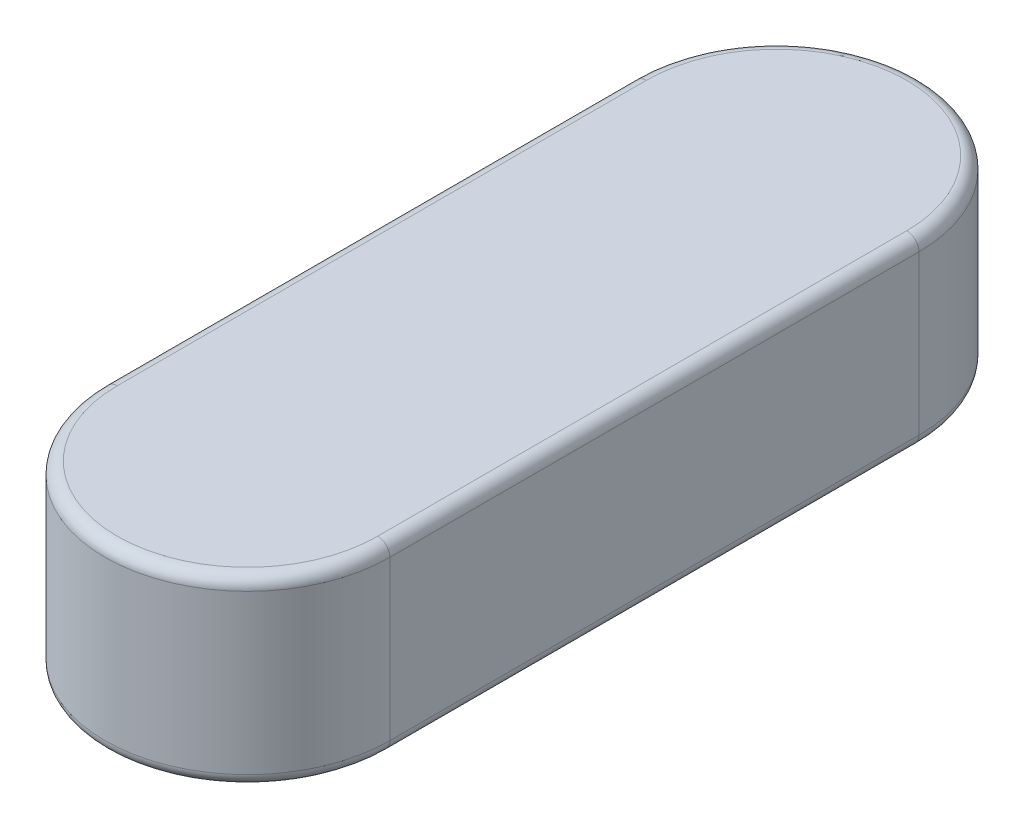
ISO-10303-21;
HEADER;
FILE_DESCRIPTION(('STEP AP214'),'2;1');
FILE_NAME('part.step','',(''),(''),'','','');
FILE_SCHEMA(('AUTOMOTIVE_DESIGN { 1 0 10303 214 1 1 1 1 }'));
ENDSEC;
DATA;
#1=APPLICATION_CONTEXT('core data for automotive mechanical design processes');
#2=APPLICATION_PROTOCOL_DEFINITION('international standard','automotive_design',2000,#1);
#3=PRODUCT_CONTEXT('',#1,'mechanical');
#4=PRODUCT('Part','Part','',(#3));
#5=PRODUCT_RELATED_PRODUCT_CATEGORY('part','',(#4));
#6=PRODUCT_DEFINITION_FORMATION('','',#4);
#7=PRODUCT_DEFINITION_CONTEXT('part definition',#1,'design');
#8=PRODUCT_DEFINITION('design','',#6,#7);
#9=PRODUCT_DEFINITION_SHAPE('','',#8);
#10=(LENGTH_UNIT() NAMED_UNIT(*) SI_UNIT(.MILLI.,.METRE.));
#11=(NAMED_UNIT(*) PLANE_ANGLE_UNIT() SI_UNIT($,.RADIAN.));
#12=(NAMED_UNIT(*) SI_UNIT($,.STERADIAN.) SOLID_ANGLE_UNIT());
#13=UNCERTAINTY_MEASURE_WITH_UNIT(LENGTH_MEASURE(1.E-05),#10,'distance_accuracy_value','');
#14=(GEOMETRIC_REPRESENTATION_CONTEXT(3) GLOBAL_UNCERTAINTY_ASSIGNED_CONTEXT((#13)) GLOBAL_UNIT_ASSIGNED_CONTEXT((#10,
#11,#12)) REPRESENTATION_CONTEXT('',''));
#15=CARTESIAN_POINT('',(0.,0.,0.));
#16=DIRECTION('',(0.,0.,1.));
#17=DIRECTION('',(1.,0.,0.));
#18=AXIS2_PLACEMENT_3D('',#15,#16,#17);
#19=CARTESIAN_POINT('',(0.,9.,0.));
#20=DIRECTION('',(0.,-1.,0.));
#21=DIRECTION('',(0.,0.,-1.));
#22=AXIS2_PLACEMENT_3D('',#19,#20,#21);
#23=CYLINDRICAL_SURFACE('',#22,7.);
#24=DIRECTION('',(0.,-1.,0.));
#25=VECTOR('',#24,1.);
#26=CARTESIAN_POINT('',(-7.,9.,0.));
#27=LINE('',#26,#25);
#28=CARTESIAN_POINT('',(-7.,8.4,0.));
#29=VERTEX_POINT('',#28);
#30=CARTESIAN_POINT('',(-7.,0.6,0.));
#31=VERTEX_POINT('',#30);
#32=EDGE_CURVE('E154',#29,#31,#27,.T.);
#33=ORIENTED_EDGE('',*,*,#32,.T.);
#34=CARTESIAN_POINT('',(0.,0.6,0.));
#35=DIRECTION('',(0.,1.,0.));
#36=DIRECTION('',(0.,0.,1.));
#37=AXIS2_PLACEMENT_3D('',#34,#35,#36);
#38=CIRCLE('',#37,7.);
#39=CARTESIAN_POINT('',(7.,0.6,0.));
#40=VERTEX_POINT('',#39);
#41=EDGE_CURVE('E163',#31,#40,#38,.T.);
#42=ORIENTED_EDGE('',*,*,#41,.T.);
#43=DIRECTION('',(0.,-1.,0.));
#44=VECTOR('',#43,1.);
#45=CARTESIAN_POINT('',(7.,9.,0.));
#46=LINE('',#45,#44);
#47=CARTESIAN_POINT('',(7.,8.4,0.));
#48=VERTEX_POINT('',#47);
#49=EDGE_CURVE('E132',#48,#40,#46,.T.);
#50=ORIENTED_EDGE('',*,*,#49,.F.);
#51=CARTESIAN_POINT('',(0.,8.4,0.));
#52=DIRECTION('',(0.,1.,0.));
#53=DIRECTION('',(0.,0.,1.));
#54=AXIS2_PLACEMENT_3D('',#51,#52,#53);
#55=CIRCLE('',#54,7.);
#56=EDGE_CURVE('E165',#48,#29,#55,.F.);
#57=ORIENTED_EDGE('',*,*,#56,.T.);
#58=EDGE_LOOP('',(#33,#42,#50,#57));
#59=FACE_BOUND('',#58,.T.);
#60=ADVANCED_FACE('F45',(#59),#23,.T.);
#61=CARTESIAN_POINT('',(7.,9.,0.));
#62=DIRECTION('',(-1.,0.,0.));
#63=DIRECTION('',(0.,0.,1.));
#64=AXIS2_PLACEMENT_3D('',#61,#62,#63);
#65=PLANE('',#64);
#66=ORIENTED_EDGE('',*,*,#49,.T.);
#67=DIRECTION('',(0.,0.,-1.));
#68=VECTOR('',#67,1.);
#69=CARTESIAN_POINT('',(7.,0.6,0.));
#70=LINE('',#69,#68);
#71=CARTESIAN_POINT('',(7.,0.6,-26.));
#72=VERTEX_POINT('',#71);
#73=EDGE_CURVE('E131',#40,#72,#70,.T.);
#74=ORIENTED_EDGE('',*,*,#73,.T.);
#75=DIRECTION('',(0.,-1.,0.));
#76=VECTOR('',#75,1.);
#77=CARTESIAN_POINT('',(7.,9.,-26.));
#78=LINE('',#77,#76);
#79=CARTESIAN_POINT('',(7.,8.4,-26.));
#80=VERTEX_POINT('',#79);
#81=EDGE_CURVE('E114',#80,#72,#78,.T.);
#82=ORIENTED_EDGE('',*,*,#81,.F.);
#83=DIRECTION('',(0.,0.,-1.));
#84=VECTOR('',#83,1.);
#85=CARTESIAN_POINT('',(7.,8.4,0.));
#86=LINE('',#85,#84);
#87=EDGE_CURVE('E128',#80,#48,#86,.F.);
#88=ORIENTED_EDGE('',*,*,#87,.T.);
#89=EDGE_LOOP('',(#66,#74,#82,#88));
#90=FACE_BOUND('',#89,.T.);
#91=ADVANCED_FACE('F127',(#90),#65,.F.);
#92=CARTESIAN_POINT('',(0.,9.,-26.));
#93=DIRECTION('',(0.,-1.,0.));
#94=DIRECTION('',(0.,0.,-1.));
#95=AXIS2_PLACEMENT_3D('',#92,#93,#94);
#96=CYLINDRICAL_SURFACE('',#95,7.);
#97=ORIENTED_EDGE('',*,*,#81,.T.);
#98=CARTESIAN_POINT('',(0.,0.6,-26.));
#99=DIRECTION('',(0.,1.,0.));
#100=DIRECTION('',(0.,0.,1.));
#101=AXIS2_PLACEMENT_3D('',#98,#99,#100);
#102=CIRCLE('',#101,7.);
#103=CARTESIAN_POINT('',(-7.,0.6,-26.));
#104=VERTEX_POINT('',#103);
#105=EDGE_CURVE('E120',#72,#104,#102,.T.);
#106=ORIENTED_EDGE('',*,*,#105,.T.);
#107=DIRECTION('',(0.,-1.,0.));
#108=VECTOR('',#107,1.);
#109=CARTESIAN_POINT('',(-7.,9.,-26.));
#110=LINE('',#109,#108);
#111=CARTESIAN_POINT('',(-7.,8.4,-26.));
#112=VERTEX_POINT('',#111);
#113=EDGE_CURVE('E116',#112,#104,#110,.T.);
#114=ORIENTED_EDGE('',*,*,#113,.F.);
#115=CARTESIAN_POINT('',(0.,8.4,-26.));
#116=DIRECTION('',(0.,1.,0.));
#117=DIRECTION('',(0.,0.,1.));
#118=AXIS2_PLACEMENT_3D('',#115,#116,#117);
#119=CIRCLE('',#118,7.);
#120=EDGE_CURVE('E111',#112,#80,#119,.F.);
#121=ORIENTED_EDGE('',*,*,#120,.T.);
#122=EDGE_LOOP('',(#97,#106,#114,#121));
#123=FACE_BOUND('',#122,.T.);
#124=ADVANCED_FACE('F113',(#123),#96,.T.);
#125=CARTESIAN_POINT('',(-7.,9.,0.));
#126=DIRECTION('',(1.,0.,0.));
#127=DIRECTION('',(0.,0.,-1.));
#128=AXIS2_PLACEMENT_3D('',#125,#126,#127);
#129=PLANE('',#128);
#130=ORIENTED_EDGE('',*,*,#113,.T.);
#131=DIRECTION('',(0.,0.,1.));
#132=VECTOR('',#131,1.);
#133=CARTESIAN_POINT('',(-7.,0.6,0.));
#134=LINE('',#133,#132);
#135=EDGE_CURVE('E167',#104,#31,#134,.T.);
#136=ORIENTED_EDGE('',*,*,#135,.T.);
#137=ORIENTED_EDGE('',*,*,#32,.F.);
#138=DIRECTION('',(0.,0.,1.));
#139=VECTOR('',#138,1.);
#140=CARTESIAN_POINT('',(-7.,8.4,-26.));
#141=LINE('',#140,#139);
#142=EDGE_CURVE('E169',#29,#112,#141,.F.);
#143=ORIENTED_EDGE('',*,*,#142,.T.);
#144=EDGE_LOOP('',(#130,#136,#137,#143));
#145=FACE_BOUND('',#144,.T.);
#146=ADVANCED_FACE('F207',(#145),#129,.F.);
#147=CARTESIAN_POINT('',(0.,9.,0.));
#148=DIRECTION('',(0.,1.,0.));
#149=DIRECTION('',(0.,0.,1.));
#150=AXIS2_PLACEMENT_3D('',#147,#148,#149);
#151=PLANE('',#150);
#152=CARTESIAN_POINT('',(0.,9.,-26.));
#153=DIRECTION('',(0.,1.,0.));
#154=DIRECTION('',(0.,0.,1.));
#155=AXIS2_PLACEMENT_3D('',#152,#153,#154);
#156=CIRCLE('',#155,6.4);
#157=CARTESIAN_POINT('',(6.4,9.,-26.));
#158=VERTEX_POINT('',#157);
#159=CARTESIAN_POINT('',(-6.4,9.,-26.));
#160=VERTEX_POINT('',#159);
#161=EDGE_CURVE('E54',#158,#160,#156,.T.);
#162=ORIENTED_EDGE('',*,*,#161,.T.);
#163=DIRECTION('',(0.,0.,1.));
#164=VECTOR('',#163,1.);
#165=CARTESIAN_POINT('',(-6.4,9.,0.));
#166=LINE('',#165,#164);
#167=CARTESIAN_POINT('',(-6.4,9.,0.));
#168=VERTEX_POINT('',#167);
#169=EDGE_CURVE('E11',#160,#168,#166,.T.);
#170=ORIENTED_EDGE('',*,*,#169,.T.);
#171=CARTESIAN_POINT('',(0.,9.,0.));
#172=DIRECTION('',(0.,1.,0.));
#173=DIRECTION('',(0.,0.,1.));
#174=AXIS2_PLACEMENT_3D('',#171,#172,#173);
#175=CIRCLE('',#174,6.4);
#176=CARTESIAN_POINT('',(6.4,9.,0.));
#177=VERTEX_POINT('',#176);
#178=EDGE_CURVE('E161',#168,#177,#175,.T.);
#179=ORIENTED_EDGE('',*,*,#178,.T.);
#180=DIRECTION('',(0.,0.,-1.));
#181=VECTOR('',#180,1.);
#182=CARTESIAN_POINT('',(6.4,9.,-26.));
#183=LINE('',#182,#181);
#184=EDGE_CURVE('E65',#177,#158,#183,.T.);
#185=ORIENTED_EDGE('',*,*,#184,.T.);
#186=EDGE_LOOP('',(#162,#170,#179,#185));
#187=FACE_BOUND('',#186,.T.);
#188=ADVANCED_FACE('F213',(#187),#151,.T.);
#189=CARTESIAN_POINT('',(0.,0.,0.));
#190=DIRECTION('',(0.,1.,0.));
#191=DIRECTION('',(0.,0.,1.));
#192=AXIS2_PLACEMENT_3D('',#189,#190,#191);
#193=PLANE('',#192);
#194=CARTESIAN_POINT('',(0.,0.,-26.));
#195=DIRECTION('',(0.,1.,0.));
#196=DIRECTION('',(0.,0.,1.));
#197=AXIS2_PLACEMENT_3D('',#194,#195,#196);
#198=CIRCLE('',#197,6.4);
#199=CARTESIAN_POINT('',(-6.4,0.,-26.));
#200=VERTEX_POINT('',#199);
#201=CARTESIAN_POINT('',(6.4,0.,-26.));
#202=VERTEX_POINT('',#201);
#203=EDGE_CURVE('E174',#200,#202,#198,.F.);
#204=ORIENTED_EDGE('',*,*,#203,.T.);
#205=DIRECTION('',(0.,0.,-1.));
#206=VECTOR('',#205,1.);
#207=CARTESIAN_POINT('',(6.4,0.,0.));
#208=LINE('',#207,#206);
#209=CARTESIAN_POINT('',(6.4,0.,0.));
#210=VERTEX_POINT('',#209);
#211=EDGE_CURVE('E121',#202,#210,#208,.F.);
#212=ORIENTED_EDGE('',*,*,#211,.T.);
#213=CARTESIAN_POINT('',(0.,0.,0.));
#214=DIRECTION('',(0.,1.,0.));
#215=DIRECTION('',(0.,0.,1.));
#216=AXIS2_PLACEMENT_3D('',#213,#214,#215);
#217=CIRCLE('',#216,6.4);
#218=CARTESIAN_POINT('',(-6.4,0.,0.));
#219=VERTEX_POINT('',#218);
#220=EDGE_CURVE('E178',#210,#219,#217,.F.);
#221=ORIENTED_EDGE('',*,*,#220,.T.);
#222=DIRECTION('',(0.,0.,1.));
#223=VECTOR('',#222,1.);
#224=CARTESIAN_POINT('',(-6.4,0.,0.));
#225=LINE('',#224,#223);
#226=EDGE_CURVE('E176',#219,#200,#225,.F.);
#227=ORIENTED_EDGE('',*,*,#226,.T.);
#228=EDGE_LOOP('',(#204,#212,#221,#227));
#229=FACE_BOUND('',#228,.T.);
#230=ADVANCED_FACE('F215',(#229),#193,.F.);
#231=CARTESIAN_POINT('',(-6.4,0.6,0.));
#232=DIRECTION('',(0.,0.,1.));
#233=DIRECTION('',(1.,0.,0.));
#234=AXIS2_PLACEMENT_3D('',#231,#232,#233);
#235=CYLINDRICAL_SURFACE('',#234,0.6);
#236=CARTESIAN_POINT('',(-6.4,0.6,-26.));
#237=DIRECTION('',(0.,0.,-1.));
#238=DIRECTION('',(-1.,0.,0.));
#239=AXIS2_PLACEMENT_3D('',#236,#237,#238);
#240=CIRCLE('',#239,0.6);
#241=EDGE_CURVE('E155',#200,#104,#240,.T.);
#242=ORIENTED_EDGE('',*,*,#241,.F.);
#243=ORIENTED_EDGE('',*,*,#226,.F.);
#244=CARTESIAN_POINT('',(-6.4,0.6,0.));
#245=DIRECTION('',(0.,0.,1.));
#246=DIRECTION('',(1.,0.,0.));
#247=AXIS2_PLACEMENT_3D('',#244,#245,#246);
#248=CIRCLE('',#247,0.6);
#249=EDGE_CURVE('E151',#31,#219,#248,.T.);
#250=ORIENTED_EDGE('',*,*,#249,.F.);
#251=ORIENTED_EDGE('',*,*,#135,.F.);
#252=EDGE_LOOP('',(#242,#243,#250,#251));
#253=FACE_BOUND('',#252,.T.);
#254=ADVANCED_FACE('F194',(#253),#235,.T.);
#255=CARTESIAN_POINT('',(0.,0.6,0.));
#256=DIRECTION('',(0.,1.,0.));
#257=DIRECTION('',(0.,0.,1.));
#258=AXIS2_PLACEMENT_3D('',#255,#256,#257);
#259=TOROIDAL_SURFACE('',#258,6.4,0.6);
#260=ORIENTED_EDGE('',*,*,#249,.T.);
#261=ORIENTED_EDGE('',*,*,#220,.F.);
#262=CARTESIAN_POINT('',(6.4,0.6,0.));
#263=DIRECTION('',(0.,0.,-1.));
#264=DIRECTION('',(0.,1.,0.));
#265=AXIS2_PLACEMENT_3D('',#262,#263,#264);
#266=CIRCLE('',#265,0.6);
#267=EDGE_CURVE('E142',#40,#210,#266,.T.);
#268=ORIENTED_EDGE('',*,*,#267,.F.);
#269=ORIENTED_EDGE('',*,*,#41,.F.);
#270=EDGE_LOOP('',(#260,#261,#268,#269));
#271=FACE_BOUND('',#270,.T.);
#272=ADVANCED_FACE('F198',(#271),#259,.T.);
#273=CARTESIAN_POINT('',(0.,0.6,-26.));
#274=DIRECTION('',(0.,1.,0.));
#275=DIRECTION('',(0.,0.,1.));
#276=AXIS2_PLACEMENT_3D('',#273,#274,#275);
#277=TOROIDAL_SURFACE('',#276,6.4,0.6);
#278=ORIENTED_EDGE('',*,*,#241,.T.);
#279=ORIENTED_EDGE('',*,*,#105,.F.);
#280=CARTESIAN_POINT('',(6.4,0.6,-26.));
#281=DIRECTION('',(0.,0.,1.));
#282=DIRECTION('',(1.,0.,0.));
#283=AXIS2_PLACEMENT_3D('',#280,#281,#282);
#284=CIRCLE('',#283,0.6);
#285=EDGE_CURVE('E141',#202,#72,#284,.T.);
#286=ORIENTED_EDGE('',*,*,#285,.F.);
#287=ORIENTED_EDGE('',*,*,#203,.F.);
#288=EDGE_LOOP('',(#278,#279,#286,#287));
#289=FACE_BOUND('',#288,.T.);
#290=ADVANCED_FACE('F206',(#289),#277,.T.);
#291=CARTESIAN_POINT('',(6.4,0.6,0.));
#292=DIRECTION('',(0.,0.,-1.));
#293=DIRECTION('',(-1.,0.,0.));
#294=AXIS2_PLACEMENT_3D('',#291,#292,#293);
#295=CYLINDRICAL_SURFACE('',#294,0.6);
#296=ORIENTED_EDGE('',*,*,#267,.T.);
#297=ORIENTED_EDGE('',*,*,#211,.F.);
#298=ORIENTED_EDGE('',*,*,#285,.T.);
#299=ORIENTED_EDGE('',*,*,#73,.F.);
#300=EDGE_LOOP('',(#296,#297,#298,#299));
#301=FACE_BOUND('',#300,.T.);
#302=ADVANCED_FACE('F201',(#301),#295,.T.);
#303=CARTESIAN_POINT('',(6.4,8.4,0.));
#304=DIRECTION('',(0.,0.,1.));
#305=DIRECTION('',(1.,0.,0.));
#306=AXIS2_PLACEMENT_3D('',#303,#304,#305);
#307=CYLINDRICAL_SURFACE('',#306,0.6);
#308=CARTESIAN_POINT('',(6.4,8.4,0.));
#309=DIRECTION('',(0.,0.,1.));
#310=DIRECTION('',(1.,0.,0.));
#311=AXIS2_PLACEMENT_3D('',#308,#309,#310);
#312=CIRCLE('',#311,0.6);
#313=EDGE_CURVE('E137',#48,#177,#312,.T.);
#314=ORIENTED_EDGE('',*,*,#313,.F.);
#315=ORIENTED_EDGE('',*,*,#87,.F.);
#316=CARTESIAN_POINT('',(6.4,8.4,-26.));
#317=DIRECTION('',(0.,0.,-1.));
#318=DIRECTION('',(-1.,0.,0.));
#319=AXIS2_PLACEMENT_3D('',#316,#317,#318);
#320=CIRCLE('',#319,0.6);
#321=EDGE_CURVE('E49',#158,#80,#320,.T.);
#322=ORIENTED_EDGE('',*,*,#321,.F.);
#323=ORIENTED_EDGE('',*,*,#184,.F.);
#324=EDGE_LOOP('',(#314,#315,#322,#323));
#325=FACE_BOUND('',#324,.T.);
#326=ADVANCED_FACE('F47',(#325),#307,.T.);
#327=CARTESIAN_POINT('',(0.,8.4,-26.));
#328=DIRECTION('',(0.,1.,0.));
#329=DIRECTION('',(0.,0.,1.));
#330=AXIS2_PLACEMENT_3D('',#327,#328,#329);
#331=TOROIDAL_SURFACE('',#330,6.4,0.6);
#332=ORIENTED_EDGE('',*,*,#321,.T.);
#333=ORIENTED_EDGE('',*,*,#120,.F.);
#334=CARTESIAN_POINT('',(-6.4,8.4,-26.));
#335=DIRECTION('',(0.,0.,1.));
#336=DIRECTION('',(1.,0.,0.));
#337=AXIS2_PLACEMENT_3D('',#334,#335,#336);
#338=CIRCLE('',#337,0.6);
#339=EDGE_CURVE('E144',#160,#112,#338,.T.);
#340=ORIENTED_EDGE('',*,*,#339,.F.);
#341=ORIENTED_EDGE('',*,*,#161,.F.);
#342=EDGE_LOOP('',(#332,#333,#340,#341));
#343=FACE_BOUND('',#342,.T.);
#344=ADVANCED_FACE('F140',(#343),#331,.T.);
#345=CARTESIAN_POINT('',(0.,8.4,0.));
#346=DIRECTION('',(0.,1.,0.));
#347=DIRECTION('',(0.,0.,1.));
#348=AXIS2_PLACEMENT_3D('',#345,#346,#347);
#349=TOROIDAL_SURFACE('',#348,6.4,0.6);
#350=ORIENTED_EDGE('',*,*,#313,.T.);
#351=ORIENTED_EDGE('',*,*,#178,.F.);
#352=CARTESIAN_POINT('',(-6.4,8.4,0.));
#353=DIRECTION('',(0.,0.,-1.));
#354=DIRECTION('',(0.,1.,0.));
#355=AXIS2_PLACEMENT_3D('',#352,#353,#354);
#356=CIRCLE('',#355,0.6);
#357=EDGE_CURVE('E147',#29,#168,#356,.T.);
#358=ORIENTED_EDGE('',*,*,#357,.F.);
#359=ORIENTED_EDGE('',*,*,#56,.F.);
#360=EDGE_LOOP('',(#350,#351,#358,#359));
#361=FACE_BOUND('',#360,.T.);
#362=ADVANCED_FACE('F212',(#361),#349,.T.);
#363=CARTESIAN_POINT('',(-6.4,8.4,0.));
#364=DIRECTION('',(0.,0.,-1.));
#365=DIRECTION('',(-1.,0.,0.));
#366=AXIS2_PLACEMENT_3D('',#363,#364,#365);
#367=CYLINDRICAL_SURFACE('',#366,0.6);
#368=ORIENTED_EDGE('',*,*,#339,.T.);
#369=ORIENTED_EDGE('',*,*,#142,.F.);
#370=ORIENTED_EDGE('',*,*,#357,.T.);
#371=ORIENTED_EDGE('',*,*,#169,.F.);
#372=EDGE_LOOP('',(#368,#369,#370,#371));
#373=FACE_BOUND('',#372,.T.);
#374=ADVANCED_FACE('F210',(#373),#367,.T.);
#375=CLOSED_SHELL('',(#60,#91,#124,#146,#188,#230,#254,#272,#290,#302,#326,#344,#362,#374));
#376=MANIFOLD_SOLID_BREP('B2',#375);
#377=ADVANCED_BREP_SHAPE_REPRESENTATION('',(#18,#376),#14);
#378=SHAPE_DEFINITION_REPRESENTATION(#9,#377);
ENDSEC;
END-ISO-10303-21;
